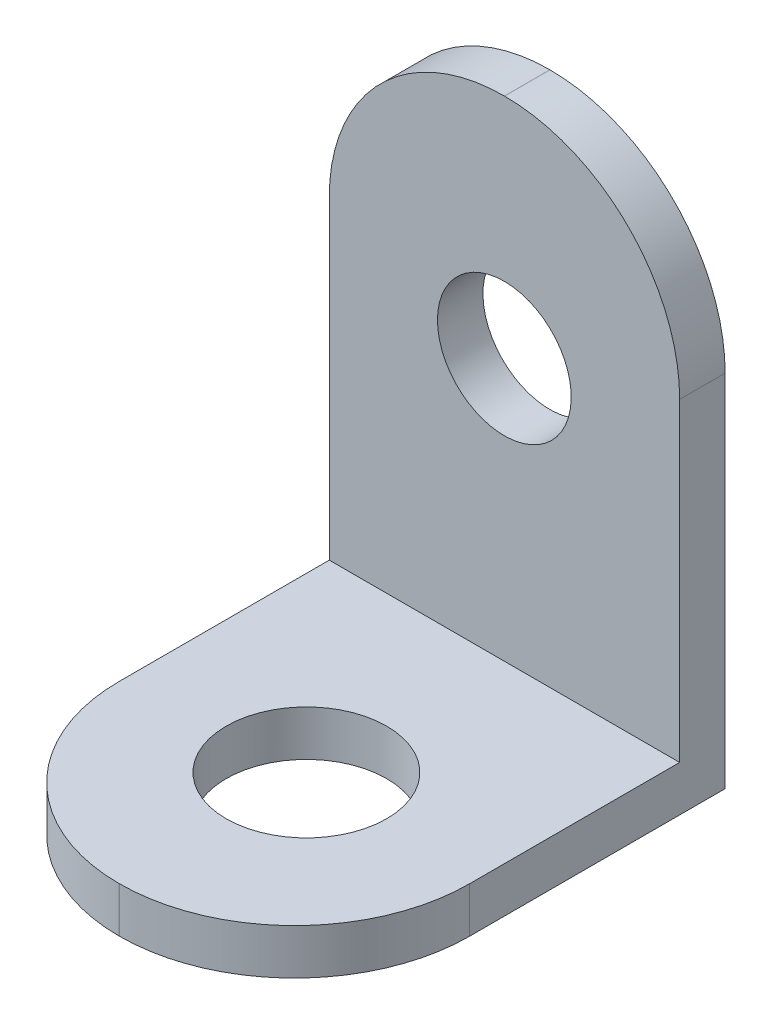
ISO-10303-21;
HEADER;
FILE_DESCRIPTION(('STEP AP214'),'2;1');
FILE_NAME('part.step','',(''),(''),'','','');
FILE_SCHEMA(('AUTOMOTIVE_DESIGN { 1 0 10303 214 1 1 1 1 }'));
ENDSEC;
DATA;
#1=APPLICATION_CONTEXT('core data for automotive mechanical design processes');
#2=APPLICATION_PROTOCOL_DEFINITION('international standard','automotive_design',2000,#1);
#3=PRODUCT_CONTEXT('',#1,'mechanical');
#4=PRODUCT('Part','Part','',(#3));
#5=PRODUCT_RELATED_PRODUCT_CATEGORY('part','',(#4));
#6=PRODUCT_DEFINITION_FORMATION('','',#4);
#7=PRODUCT_DEFINITION_CONTEXT('part definition',#1,'design');
#8=PRODUCT_DEFINITION('design','',#6,#7);
#9=PRODUCT_DEFINITION_SHAPE('','',#8);
#10=(LENGTH_UNIT() NAMED_UNIT(*) SI_UNIT(.MILLI.,.METRE.));
#11=(NAMED_UNIT(*) PLANE_ANGLE_UNIT() SI_UNIT($,.RADIAN.));
#12=(NAMED_UNIT(*) SI_UNIT($,.STERADIAN.) SOLID_ANGLE_UNIT());
#13=UNCERTAINTY_MEASURE_WITH_UNIT(LENGTH_MEASURE(1.E-05),#10,'distance_accuracy_value','');
#14=(GEOMETRIC_REPRESENTATION_CONTEXT(3) GLOBAL_UNCERTAINTY_ASSIGNED_CONTEXT((#13)) GLOBAL_UNIT_ASSIGNED_CONTEXT((#10,
#11,#12)) REPRESENTATION_CONTEXT('',''));
#15=CARTESIAN_POINT('',(0.,0.,0.));
#16=DIRECTION('',(0.,0.,1.));
#17=DIRECTION('',(1.,0.,0.));
#18=AXIS2_PLACEMENT_3D('',#15,#16,#17);
#19=CARTESIAN_POINT('',(-6.44603174603176,0.,6.1));
#20=DIRECTION('',(0.,-1.,0.));
#21=DIRECTION('',(0.,0.,-1.));
#22=AXIS2_PLACEMENT_3D('',#19,#20,#21);
#23=PLANE('',#22);
#24=CARTESIAN_POINT('',(0.,0.,-1.));
#25=DIRECTION('',(0.,-1.,0.));
#26=DIRECTION('',(0.,0.,-1.));
#27=AXIS2_PLACEMENT_3D('',#24,#25,#26);
#28=CIRCLE('',#27,3.);
#29=CARTESIAN_POINT('',(0.,0.,-4.));
#30=VERTEX_POINT('',#29);
#31=EDGE_CURVE('E193',#30,#30,#28,.T.);
#32=ORIENTED_EDGE('',*,*,#31,.F.);
#33=EDGE_LOOP('',(#32));
#34=FACE_BOUND('',#33,.T.);
#35=DIRECTION('',(1.,0.,0.));
#36=VECTOR('',#35,1.);
#37=CARTESIAN_POINT('',(-6.44603174603176,0.,6.1));
#38=LINE('',#37,#36);
#39=CARTESIAN_POINT('',(0.0989682539682358,0.,6.1));
#40=VERTEX_POINT('',#39);
#41=CARTESIAN_POINT('',(0.108968253968232,0.,6.1));
#42=VERTEX_POINT('',#41);
#43=EDGE_CURVE('E156',#40,#42,#38,.T.);
#44=ORIENTED_EDGE('',*,*,#43,.F.);
#45=CARTESIAN_POINT('',(0.0989682539682358,0.,-0.445));
#46=DIRECTION('',(0.,-1.,0.));
#47=DIRECTION('',(0.,0.,-1.));
#48=AXIS2_PLACEMENT_3D('',#45,#46,#47);
#49=CIRCLE('',#48,6.545);
#50=CARTESIAN_POINT('',(-6.44603174603176,0.,-0.445));
#51=VERTEX_POINT('',#50);
#52=EDGE_CURVE('E170',#40,#51,#49,.T.);
#53=ORIENTED_EDGE('',*,*,#52,.T.);
#54=DIRECTION('',(0.,0.,-1.));
#55=VECTOR('',#54,1.);
#56=CARTESIAN_POINT('',(-6.44603174603176,0.,6.1));
#57=LINE('',#56,#55);
#58=CARTESIAN_POINT('',(-6.44603174603176,0.,-10.));
#59=VERTEX_POINT('',#58);
#60=EDGE_CURVE('E147',#51,#59,#57,.T.);
#61=ORIENTED_EDGE('',*,*,#60,.T.);
#62=DIRECTION('',(1.,0.,0.));
#63=VECTOR('',#62,1.);
#64=CARTESIAN_POINT('',(-6.44603174603176,0.,-10.));
#65=LINE('',#64,#63);
#66=CARTESIAN_POINT('',(6.65396825396823,0.,-10.));
#67=VERTEX_POINT('',#66);
#68=EDGE_CURVE('E152',#59,#67,#65,.T.);
#69=ORIENTED_EDGE('',*,*,#68,.T.);
#70=DIRECTION('',(0.,0.,-1.));
#71=VECTOR('',#70,1.);
#72=CARTESIAN_POINT('',(6.65396825396823,0.,6.1));
#73=LINE('',#72,#71);
#74=CARTESIAN_POINT('',(6.65396825396823,0.,-0.445));
#75=VERTEX_POINT('',#74);
#76=EDGE_CURVE('E144',#75,#67,#73,.T.);
#77=ORIENTED_EDGE('',*,*,#76,.F.);
#78=CARTESIAN_POINT('',(0.108968253968232,0.,-0.445));
#79=DIRECTION('',(0.,-1.,0.));
#80=DIRECTION('',(0.,0.,-1.));
#81=AXIS2_PLACEMENT_3D('',#78,#79,#80);
#82=CIRCLE('',#81,6.545);
#83=EDGE_CURVE('E168',#75,#42,#82,.T.);
#84=ORIENTED_EDGE('',*,*,#83,.T.);
#85=EDGE_LOOP('',(#44,#53,#61,#69,#77,#84));
#86=FACE_BOUND('',#85,.T.);
#87=ADVANCED_FACE('F32',(#34,#86),#23,.T.);
#88=CARTESIAN_POINT('',(-6.44603174603176,20.,6.1));
#89=DIRECTION('',(0.,0.,1.));
#90=DIRECTION('',(1.,0.,0.));
#91=AXIS2_PLACEMENT_3D('',#88,#89,#90);
#92=PLANE('',#91);
#93=DIRECTION('',(-1.,0.,0.));
#94=VECTOR('',#93,1.);
#95=CARTESIAN_POINT('',(6.65396825396824,1.7,6.1));
#96=LINE('',#95,#94);
#97=CARTESIAN_POINT('',(0.108968253968234,1.7,6.1));
#98=VERTEX_POINT('',#97);
#99=CARTESIAN_POINT('',(0.0989682539682376,1.7,6.1));
#100=VERTEX_POINT('',#99);
#101=EDGE_CURVE('E131',#98,#100,#96,.T.);
#102=ORIENTED_EDGE('',*,*,#101,.T.);
#103=DIRECTION('',(0.,-1.,0.));
#104=VECTOR('',#103,1.);
#105=CARTESIAN_POINT('',(0.0989682539682358,0.,6.1));
#106=LINE('',#105,#104);
#107=EDGE_CURVE('E165',#100,#40,#106,.T.);
#108=ORIENTED_EDGE('',*,*,#107,.T.);
#109=ORIENTED_EDGE('',*,*,#43,.T.);
#110=DIRECTION('',(0.,-1.,0.));
#111=VECTOR('',#110,1.);
#112=CARTESIAN_POINT('',(0.108968253968232,20.,6.1));
#113=LINE('',#112,#111);
#114=EDGE_CURVE('E159',#42,#98,#113,.F.);
#115=ORIENTED_EDGE('',*,*,#114,.T.);
#116=EDGE_LOOP('',(#102,#108,#109,#115));
#117=FACE_BOUND('',#116,.T.);
#118=ADVANCED_FACE('F214',(#117),#92,.T.);
#119=CARTESIAN_POINT('',(-6.44603174603176,20.,-10.));
#120=DIRECTION('',(0.,1.,0.));
#121=DIRECTION('',(0.,0.,1.));
#122=AXIS2_PLACEMENT_3D('',#119,#120,#121);
#123=PLANE('',#122);
#124=DIRECTION('',(1.,0.,0.));
#125=VECTOR('',#124,1.);
#126=CARTESIAN_POINT('',(-6.44603174603176,20.,-10.));
#127=LINE('',#126,#125);
#128=CARTESIAN_POINT('',(0.0989682539682358,20.,-10.));
#129=VERTEX_POINT('',#128);
#130=CARTESIAN_POINT('',(0.108968253968232,20.,-10.));
#131=VERTEX_POINT('',#130);
#132=EDGE_CURVE('E160',#129,#131,#127,.T.);
#133=ORIENTED_EDGE('',*,*,#132,.F.);
#134=DIRECTION('',(0.,0.,1.));
#135=VECTOR('',#134,1.);
#136=CARTESIAN_POINT('',(0.0989682539682358,20.,-8.3));
#137=LINE('',#136,#135);
#138=CARTESIAN_POINT('',(0.0989682539682376,20.,-8.3));
#139=VERTEX_POINT('',#138);
#140=EDGE_CURVE('E186',#129,#139,#137,.T.);
#141=ORIENTED_EDGE('',*,*,#140,.T.);
#142=DIRECTION('',(-1.,0.,0.));
#143=VECTOR('',#142,1.);
#144=CARTESIAN_POINT('',(6.65396825396823,20.,-8.3));
#145=LINE('',#144,#143);
#146=CARTESIAN_POINT('',(0.108968253968234,20.,-8.3));
#147=VERTEX_POINT('',#146);
#148=EDGE_CURVE('E132',#147,#139,#145,.T.);
#149=ORIENTED_EDGE('',*,*,#148,.F.);
#150=DIRECTION('',(0.,0.,1.));
#151=VECTOR('',#150,1.);
#152=CARTESIAN_POINT('',(0.108968253968232,20.,-10.));
#153=LINE('',#152,#151);
#154=EDGE_CURVE('E49',#147,#131,#153,.F.);
#155=ORIENTED_EDGE('',*,*,#154,.T.);
#156=EDGE_LOOP('',(#133,#141,#149,#155));
#157=FACE_BOUND('',#156,.T.);
#158=ADVANCED_FACE('F226',(#157),#123,.T.);
#159=CARTESIAN_POINT('',(-6.44603174603176,0.,-10.));
#160=DIRECTION('',(0.,0.,-1.));
#161=DIRECTION('',(0.,1.,0.));
#162=AXIS2_PLACEMENT_3D('',#159,#160,#161);
#163=PLANE('',#162);
#164=CARTESIAN_POINT('',(0.0989682539682358,11.5,-10.));
#165=DIRECTION('',(0.,0.,-1.));
#166=DIRECTION('',(0.,1.,0.));
#167=AXIS2_PLACEMENT_3D('',#164,#165,#166);
#168=CIRCLE('',#167,2.5);
#169=CARTESIAN_POINT('',(0.0989682539682358,14.,-10.));
#170=VERTEX_POINT('',#169);
#171=EDGE_CURVE('E201',#170,#170,#168,.T.);
#172=ORIENTED_EDGE('',*,*,#171,.F.);
#173=EDGE_LOOP('',(#172));
#174=FACE_BOUND('',#173,.T.);
#175=DIRECTION('',(0.,1.,0.));
#176=VECTOR('',#175,1.);
#177=CARTESIAN_POINT('',(-6.44603174603176,0.,-10.));
#178=LINE('',#177,#176);
#179=CARTESIAN_POINT('',(-6.44603174603176,13.455,-10.));
#180=VERTEX_POINT('',#179);
#181=EDGE_CURVE('E149',#59,#180,#178,.T.);
#182=ORIENTED_EDGE('',*,*,#181,.T.);
#183=CARTESIAN_POINT('',(0.0989682539682358,13.455,-10.));
#184=DIRECTION('',(0.,0.,-1.));
#185=DIRECTION('',(0.,1.,0.));
#186=AXIS2_PLACEMENT_3D('',#183,#184,#185);
#187=CIRCLE('',#186,6.545);
#188=EDGE_CURVE('E11',#180,#129,#187,.T.);
#189=ORIENTED_EDGE('',*,*,#188,.T.);
#190=ORIENTED_EDGE('',*,*,#132,.T.);
#191=CARTESIAN_POINT('',(0.108968253968232,13.455,-10.));
#192=DIRECTION('',(0.,0.,-1.));
#193=DIRECTION('',(0.,1.,0.));
#194=AXIS2_PLACEMENT_3D('',#191,#192,#193);
#195=CIRCLE('',#194,6.545);
#196=CARTESIAN_POINT('',(6.65396825396823,13.455,-10.));
#197=VERTEX_POINT('',#196);
#198=EDGE_CURVE('E41',#131,#197,#195,.T.);
#199=ORIENTED_EDGE('',*,*,#198,.T.);
#200=DIRECTION('',(0.,1.,0.));
#201=VECTOR('',#200,1.);
#202=CARTESIAN_POINT('',(6.65396825396823,0.,-10.));
#203=LINE('',#202,#201);
#204=EDGE_CURVE('E150',#67,#197,#203,.T.);
#205=ORIENTED_EDGE('',*,*,#204,.F.);
#206=ORIENTED_EDGE('',*,*,#68,.F.);
#207=EDGE_LOOP('',(#182,#189,#190,#199,#205,#206));
#208=FACE_BOUND('',#207,.T.);
#209=ADVANCED_FACE('F221',(#174,#208),#163,.T.);
#210=CARTESIAN_POINT('',(-6.44603174603176,0.,0.));
#211=DIRECTION('',(1.,0.,0.));
#212=DIRECTION('',(0.,0.,-1.));
#213=AXIS2_PLACEMENT_3D('',#210,#211,#212);
#214=PLANE('',#213);
#215=ORIENTED_EDGE('',*,*,#60,.F.);
#216=DIRECTION('',(0.,-1.,0.));
#217=VECTOR('',#216,1.);
#218=CARTESIAN_POINT('',(-6.44603174603176,1.7,-0.445));
#219=LINE('',#218,#217);
#220=CARTESIAN_POINT('',(-6.44603174603176,1.7,-0.445000000000001));
#221=VERTEX_POINT('',#220);
#222=EDGE_CURVE('E137',#51,#221,#219,.F.);
#223=ORIENTED_EDGE('',*,*,#222,.T.);
#224=DIRECTION('',(0.,0.,1.));
#225=VECTOR('',#224,1.);
#226=CARTESIAN_POINT('',(-6.44603174603177,1.7,-8.3));
#227=LINE('',#226,#225);
#228=CARTESIAN_POINT('',(-6.44603174603177,1.7,-8.3));
#229=VERTEX_POINT('',#228);
#230=EDGE_CURVE('E121',#229,#221,#227,.T.);
#231=ORIENTED_EDGE('',*,*,#230,.F.);
#232=DIRECTION('',(0.,-1.,0.));
#233=VECTOR('',#232,1.);
#234=CARTESIAN_POINT('',(-6.44603174603177,20.,-8.3));
#235=LINE('',#234,#233);
#236=CARTESIAN_POINT('',(-6.44603174603177,13.455,-8.3));
#237=VERTEX_POINT('',#236);
#238=EDGE_CURVE('E111',#237,#229,#235,.T.);
#239=ORIENTED_EDGE('',*,*,#238,.F.);
#240=DIRECTION('',(0.,0.,1.));
#241=VECTOR('',#240,1.);
#242=CARTESIAN_POINT('',(-6.44603174603176,13.455,-10.));
#243=LINE('',#242,#241);
#244=EDGE_CURVE('E172',#237,#180,#243,.F.);
#245=ORIENTED_EDGE('',*,*,#244,.T.);
#246=ORIENTED_EDGE('',*,*,#181,.F.);
#247=EDGE_LOOP('',(#215,#223,#231,#239,#245,#246));
#248=FACE_BOUND('',#247,.T.);
#249=ADVANCED_FACE('F135',(#248),#214,.F.);
#250=CARTESIAN_POINT('',(6.65396825396823,0.,0.));
#251=DIRECTION('',(1.,0.,0.));
#252=DIRECTION('',(0.,0.,-1.));
#253=AXIS2_PLACEMENT_3D('',#250,#251,#252);
#254=PLANE('',#253);
#255=DIRECTION('',(0.,0.,1.));
#256=VECTOR('',#255,1.);
#257=CARTESIAN_POINT('',(6.65396825396823,1.7,-8.3));
#258=LINE('',#257,#256);
#259=CARTESIAN_POINT('',(6.65396825396823,1.7,-8.3));
#260=VERTEX_POINT('',#259);
#261=CARTESIAN_POINT('',(6.65396825396824,1.7,-0.444999999999999));
#262=VERTEX_POINT('',#261);
#263=EDGE_CURVE('E130',#260,#262,#258,.T.);
#264=ORIENTED_EDGE('',*,*,#263,.T.);
#265=DIRECTION('',(0.,-1.,0.));
#266=VECTOR('',#265,1.);
#267=CARTESIAN_POINT('',(6.65396825396823,0.,-0.445));
#268=LINE('',#267,#266);
#269=EDGE_CURVE('E182',#262,#75,#268,.T.);
#270=ORIENTED_EDGE('',*,*,#269,.T.);
#271=ORIENTED_EDGE('',*,*,#76,.T.);
#272=ORIENTED_EDGE('',*,*,#204,.T.);
#273=DIRECTION('',(0.,0.,1.));
#274=VECTOR('',#273,1.);
#275=CARTESIAN_POINT('',(6.65396825396823,13.455,0.));
#276=LINE('',#275,#274);
#277=CARTESIAN_POINT('',(6.65396825396823,13.455,-8.3));
#278=VERTEX_POINT('',#277);
#279=EDGE_CURVE('E179',#197,#278,#276,.T.);
#280=ORIENTED_EDGE('',*,*,#279,.T.);
#281=DIRECTION('',(0.,-1.,0.));
#282=VECTOR('',#281,1.);
#283=CARTESIAN_POINT('',(6.65396825396823,20.,-8.3));
#284=LINE('',#283,#282);
#285=EDGE_CURVE('E138',#278,#260,#284,.T.);
#286=ORIENTED_EDGE('',*,*,#285,.T.);
#287=EDGE_LOOP('',(#264,#270,#271,#272,#280,#286));
#288=FACE_BOUND('',#287,.T.);
#289=ADVANCED_FACE('F205',(#288),#254,.T.);
#290=CARTESIAN_POINT('',(6.65396825396823,1.7,-8.3));
#291=DIRECTION('',(0.,-1.,0.));
#292=DIRECTION('',(1.,0.,0.));
#293=AXIS2_PLACEMENT_3D('',#290,#291,#292);
#294=PLANE('',#293);
#295=CARTESIAN_POINT('',(0.,1.7,-1.));
#296=DIRECTION('',(0.,-1.,0.));
#297=DIRECTION('',(1.,0.,0.));
#298=AXIS2_PLACEMENT_3D('',#295,#296,#297);
#299=CIRCLE('',#298,3.);
#300=CARTESIAN_POINT('',(3.,1.7,-1.));
#301=VERTEX_POINT('',#300);
#302=EDGE_CURVE('E122',#301,#301,#299,.T.);
#303=ORIENTED_EDGE('',*,*,#302,.T.);
#304=EDGE_LOOP('',(#303));
#305=FACE_BOUND('',#304,.T.);
#306=ORIENTED_EDGE('',*,*,#230,.T.);
#307=CARTESIAN_POINT('',(0.0989682539682358,1.7,-0.445));
#308=DIRECTION('',(0.,-1.,0.));
#309=DIRECTION('',(1.,0.,0.));
#310=AXIS2_PLACEMENT_3D('',#307,#308,#309);
#311=CIRCLE('',#310,6.545);
#312=EDGE_CURVE('E177',#221,#100,#311,.F.);
#313=ORIENTED_EDGE('',*,*,#312,.T.);
#314=ORIENTED_EDGE('',*,*,#101,.F.);
#315=CARTESIAN_POINT('',(0.108968253968232,1.7,-0.445));
#316=DIRECTION('',(0.,-1.,0.));
#317=DIRECTION('',(1.,0.,0.));
#318=AXIS2_PLACEMENT_3D('',#315,#316,#317);
#319=CIRCLE('',#318,6.545);
#320=EDGE_CURVE('E175',#98,#262,#319,.F.);
#321=ORIENTED_EDGE('',*,*,#320,.T.);
#322=ORIENTED_EDGE('',*,*,#263,.F.);
#323=DIRECTION('',(-1.,0.,0.));
#324=VECTOR('',#323,1.);
#325=CARTESIAN_POINT('',(6.65396825396823,1.7,-8.3));
#326=LINE('',#325,#324);
#327=EDGE_CURVE('E116',#260,#229,#326,.T.);
#328=ORIENTED_EDGE('',*,*,#327,.T.);
#329=EDGE_LOOP('',(#306,#313,#314,#321,#322,#328));
#330=FACE_BOUND('',#329,.T.);
#331=ADVANCED_FACE('F127',(#305,#330),#294,.F.);
#332=CARTESIAN_POINT('',(6.65396825396823,20.,-8.3));
#333=DIRECTION('',(0.,0.,-1.));
#334=DIRECTION('',(-1.,0.,0.));
#335=AXIS2_PLACEMENT_3D('',#332,#333,#334);
#336=PLANE('',#335);
#337=CARTESIAN_POINT('',(0.0989682539682358,11.5,-8.3));
#338=DIRECTION('',(0.,0.,-1.));
#339=DIRECTION('',(-1.,0.,0.));
#340=AXIS2_PLACEMENT_3D('',#337,#338,#339);
#341=CIRCLE('',#340,2.5);
#342=CARTESIAN_POINT('',(-2.40103174603176,11.5,-8.3));
#343=VERTEX_POINT('',#342);
#344=EDGE_CURVE('E36',#343,#343,#341,.T.);
#345=ORIENTED_EDGE('',*,*,#344,.T.);
#346=EDGE_LOOP('',(#345));
#347=FACE_BOUND('',#346,.T.);
#348=ORIENTED_EDGE('',*,*,#148,.T.);
#349=CARTESIAN_POINT('',(0.0989682539682358,13.455,-8.3));
#350=DIRECTION('',(0.,0.,-1.));
#351=DIRECTION('',(-1.,0.,0.));
#352=AXIS2_PLACEMENT_3D('',#349,#350,#351);
#353=CIRCLE('',#352,6.545);
#354=EDGE_CURVE('E117',#139,#237,#353,.F.);
#355=ORIENTED_EDGE('',*,*,#354,.T.);
#356=ORIENTED_EDGE('',*,*,#238,.T.);
#357=ORIENTED_EDGE('',*,*,#327,.F.);
#358=ORIENTED_EDGE('',*,*,#285,.F.);
#359=CARTESIAN_POINT('',(0.108968253968232,13.455,-8.3));
#360=DIRECTION('',(0.,0.,-1.));
#361=DIRECTION('',(-1.,0.,0.));
#362=AXIS2_PLACEMENT_3D('',#359,#360,#361);
#363=CIRCLE('',#362,6.545);
#364=EDGE_CURVE('E189',#278,#147,#363,.F.);
#365=ORIENTED_EDGE('',*,*,#364,.T.);
#366=EDGE_LOOP('',(#348,#355,#356,#357,#358,#365));
#367=FACE_BOUND('',#366,.T.);
#368=ADVANCED_FACE('F114',(#347,#367),#336,.F.);
#369=CARTESIAN_POINT('',(0.0989682539682358,20.,-0.445));
#370=DIRECTION('',(0.,1.,0.));
#371=DIRECTION('',(0.,0.,1.));
#372=AXIS2_PLACEMENT_3D('',#369,#370,#371);
#373=CYLINDRICAL_SURFACE('',#372,6.545);
#374=ORIENTED_EDGE('',*,*,#312,.F.);
#375=ORIENTED_EDGE('',*,*,#222,.F.);
#376=ORIENTED_EDGE('',*,*,#52,.F.);
#377=ORIENTED_EDGE('',*,*,#107,.F.);
#378=EDGE_LOOP('',(#374,#375,#376,#377));
#379=FACE_BOUND('',#378,.T.);
#380=ADVANCED_FACE('F218',(#379),#373,.T.);
#381=CARTESIAN_POINT('',(0.108968253968232,0.,-0.445));
#382=DIRECTION('',(0.,-1.,0.));
#383=DIRECTION('',(0.,0.,-1.));
#384=AXIS2_PLACEMENT_3D('',#381,#382,#383);
#385=CYLINDRICAL_SURFACE('',#384,6.545);
#386=ORIENTED_EDGE('',*,*,#320,.F.);
#387=ORIENTED_EDGE('',*,*,#114,.F.);
#388=ORIENTED_EDGE('',*,*,#83,.F.);
#389=ORIENTED_EDGE('',*,*,#269,.F.);
#390=EDGE_LOOP('',(#386,#387,#388,#389));
#391=FACE_BOUND('',#390,.T.);
#392=ADVANCED_FACE('F209',(#391),#385,.T.);
#393=CARTESIAN_POINT('',(0.0989682539682358,13.455,-10.));
#394=DIRECTION('',(0.,0.,-1.));
#395=DIRECTION('',(-1.,0.,0.));
#396=AXIS2_PLACEMENT_3D('',#393,#394,#395);
#397=CYLINDRICAL_SURFACE('',#396,6.545);
#398=ORIENTED_EDGE('',*,*,#188,.F.);
#399=ORIENTED_EDGE('',*,*,#244,.F.);
#400=ORIENTED_EDGE('',*,*,#354,.F.);
#401=ORIENTED_EDGE('',*,*,#140,.F.);
#402=EDGE_LOOP('',(#398,#399,#400,#401));
#403=FACE_BOUND('',#402,.T.);
#404=ADVANCED_FACE('F225',(#403),#397,.T.);
#405=CARTESIAN_POINT('',(0.108968253968232,13.455,0.));
#406=DIRECTION('',(0.,0.,1.));
#407=DIRECTION('',(1.,0.,0.));
#408=AXIS2_PLACEMENT_3D('',#405,#406,#407);
#409=CYLINDRICAL_SURFACE('',#408,6.545);
#410=ORIENTED_EDGE('',*,*,#198,.F.);
#411=ORIENTED_EDGE('',*,*,#154,.F.);
#412=ORIENTED_EDGE('',*,*,#364,.F.);
#413=ORIENTED_EDGE('',*,*,#279,.F.);
#414=EDGE_LOOP('',(#410,#411,#412,#413));
#415=FACE_BOUND('',#414,.T.);
#416=ADVANCED_FACE('F34',(#415),#409,.T.);
#417=CARTESIAN_POINT('',(0.,10.,-1.));
#418=DIRECTION('',(0.,-1.,0.));
#419=DIRECTION('',(0.,0.,-1.));
#420=AXIS2_PLACEMENT_3D('',#417,#418,#419);
#421=CYLINDRICAL_SURFACE('',#420,3.);
#422=ORIENTED_EDGE('',*,*,#31,.T.);
#423=EDGE_LOOP('',(#422));
#424=FACE_BOUND('',#423,.T.);
#425=ORIENTED_EDGE('',*,*,#302,.F.);
#426=EDGE_LOOP('',(#425));
#427=FACE_BOUND('',#426,.T.);
#428=ADVANCED_FACE('F231',(#424,#427),#421,.F.);
#429=CARTESIAN_POINT('',(0.0989682539682358,11.5,0.));
#430=DIRECTION('',(0.,0.,-1.));
#431=DIRECTION('',(0.,1.,0.));
#432=AXIS2_PLACEMENT_3D('',#429,#430,#431);
#433=CYLINDRICAL_SURFACE('',#432,2.5);
#434=ORIENTED_EDGE('',*,*,#171,.T.);
#435=EDGE_LOOP('',(#434));
#436=FACE_BOUND('',#435,.T.);
#437=ORIENTED_EDGE('',*,*,#344,.F.);
#438=EDGE_LOOP('',(#437));
#439=FACE_BOUND('',#438,.T.);
#440=ADVANCED_FACE('F236',(#436,#439),#433,.F.);
#441=CLOSED_SHELL('',(#87,#118,#158,#209,#249,#289,#331,#368,#380,#392,#404,#416,#428,#440));
#442=MANIFOLD_SOLID_BREP('B2',#441);
#443=ADVANCED_BREP_SHAPE_REPRESENTATION('',(#18,#442),#14);
#444=SHAPE_DEFINITION_REPRESENTATION(#9,#443);
ENDSEC;
END-ISO-10303-21;
